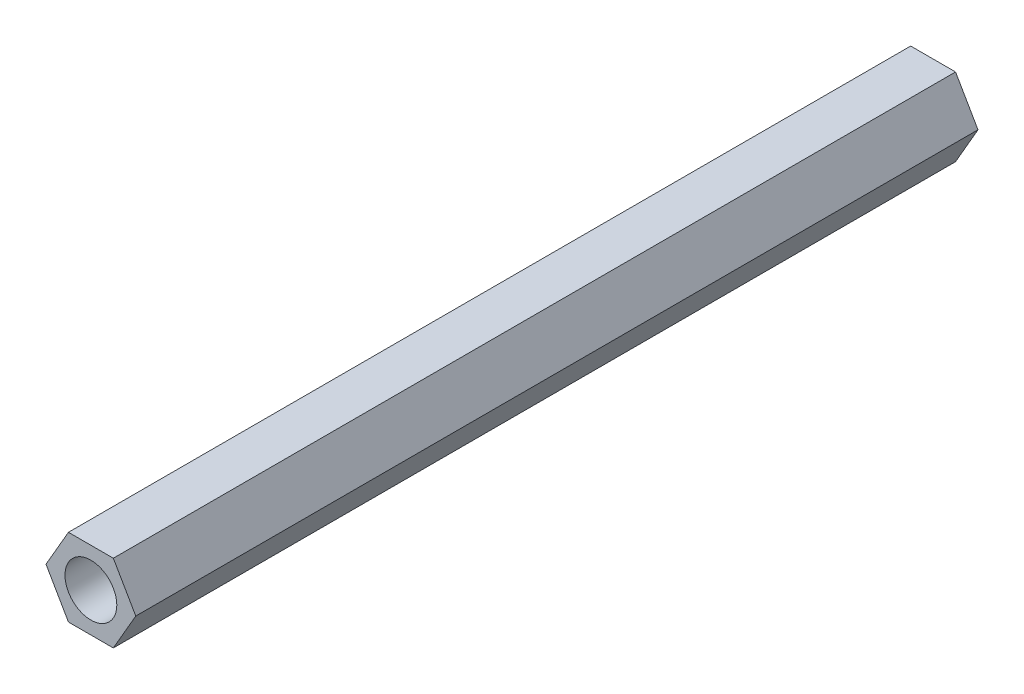
ISO-10303-21;
HEADER;
FILE_DESCRIPTION(('STEP AP214'),'2;1');
FILE_NAME('part.step','',(''),(''),'','','');
FILE_SCHEMA(('AUTOMOTIVE_DESIGN { 1 0 10303 214 1 1 1 1 }'));
ENDSEC;
DATA;
#1=APPLICATION_CONTEXT('core data for automotive mechanical design processes');
#2=APPLICATION_PROTOCOL_DEFINITION('international standard','automotive_design',2000,#1);
#3=PRODUCT_CONTEXT('',#1,'mechanical');
#4=PRODUCT('Part','Part','',(#3));
#5=PRODUCT_RELATED_PRODUCT_CATEGORY('part','',(#4));
#6=PRODUCT_DEFINITION_FORMATION('','',#4);
#7=PRODUCT_DEFINITION_CONTEXT('part definition',#1,'design');
#8=PRODUCT_DEFINITION('design','',#6,#7);
#9=PRODUCT_DEFINITION_SHAPE('','',#8);
#10=(LENGTH_UNIT() NAMED_UNIT(*) SI_UNIT(.MILLI.,.METRE.));
#11=(NAMED_UNIT(*) PLANE_ANGLE_UNIT() SI_UNIT($,.RADIAN.));
#12=(NAMED_UNIT(*) SI_UNIT($,.STERADIAN.) SOLID_ANGLE_UNIT());
#13=UNCERTAINTY_MEASURE_WITH_UNIT(LENGTH_MEASURE(1.E-05),#10,'distance_accuracy_value','');
#14=(GEOMETRIC_REPRESENTATION_CONTEXT(3) GLOBAL_UNCERTAINTY_ASSIGNED_CONTEXT((#13)) GLOBAL_UNIT_ASSIGNED_CONTEXT((#10,
#11,#12)) REPRESENTATION_CONTEXT('',''));
#15=CARTESIAN_POINT('',(0.,0.,0.));
#16=DIRECTION('',(0.,0.,1.));
#17=DIRECTION('',(1.,0.,0.));
#18=AXIS2_PLACEMENT_3D('',#15,#16,#17);
#19=CARTESIAN_POINT('',(0.,0.,65.));
#20=DIRECTION('',(0.,0.,1.));
#21=DIRECTION('',(1.,0.,0.));
#22=AXIS2_PLACEMENT_3D('',#19,#20,#21);
#23=PLANE('',#22);
#24=DIRECTION('',(-0.5,-0.866025403784439,0.));
#25=VECTOR('',#24,1.);
#26=CARTESIAN_POINT('',(-1.73205080756888,3.,65.));
#27=LINE('',#26,#25);
#28=CARTESIAN_POINT('',(-1.73205080756888,3.,65.));
#29=VERTEX_POINT('',#28);
#30=CARTESIAN_POINT('',(-3.46410161513775,0.,65.));
#31=VERTEX_POINT('',#30);
#32=EDGE_CURVE('E130',#29,#31,#27,.T.);
#33=ORIENTED_EDGE('',*,*,#32,.T.);
#34=DIRECTION('',(0.5,-0.866025403784439,0.));
#35=VECTOR('',#34,1.);
#36=CARTESIAN_POINT('',(-3.46410161513775,0.,65.));
#37=LINE('',#36,#35);
#38=CARTESIAN_POINT('',(-1.73205080756888,-3.,65.));
#39=VERTEX_POINT('',#38);
#40=EDGE_CURVE('E88',#31,#39,#37,.T.);
#41=ORIENTED_EDGE('',*,*,#40,.T.);
#42=DIRECTION('',(1.,0.,0.));
#43=VECTOR('',#42,1.);
#44=CARTESIAN_POINT('',(-1.73205080756888,-3.,65.));
#45=LINE('',#44,#43);
#46=CARTESIAN_POINT('',(1.73205080756888,-3.,65.));
#47=VERTEX_POINT('',#46);
#48=EDGE_CURVE('E101',#39,#47,#45,.T.);
#49=ORIENTED_EDGE('',*,*,#48,.T.);
#50=DIRECTION('',(0.5,0.866025403784439,0.));
#51=VECTOR('',#50,1.);
#52=CARTESIAN_POINT('',(1.73205080756888,-3.,65.));
#53=LINE('',#52,#51);
#54=CARTESIAN_POINT('',(3.46410161513775,0.,65.));
#55=VERTEX_POINT('',#54);
#56=EDGE_CURVE('E95',#47,#55,#53,.T.);
#57=ORIENTED_EDGE('',*,*,#56,.T.);
#58=DIRECTION('',(-0.5,0.866025403784439,0.));
#59=VECTOR('',#58,1.);
#60=CARTESIAN_POINT('',(3.46410161513775,0.,65.));
#61=LINE('',#60,#59);
#62=CARTESIAN_POINT('',(1.73205080756888,3.,65.));
#63=VERTEX_POINT('',#62);
#64=EDGE_CURVE('E99',#55,#63,#61,.T.);
#65=ORIENTED_EDGE('',*,*,#64,.T.);
#66=DIRECTION('',(-1.,0.,0.));
#67=VECTOR('',#66,1.);
#68=CARTESIAN_POINT('',(1.73205080756888,3.,65.));
#69=LINE('',#68,#67);
#70=EDGE_CURVE('E51',#63,#29,#69,.T.);
#71=ORIENTED_EDGE('',*,*,#70,.T.);
#72=EDGE_LOOP('',(#33,#41,#49,#57,#65,#71));
#73=FACE_BOUND('',#72,.T.);
#74=CARTESIAN_POINT('',(0.,0.,65.));
#75=DIRECTION('',(0.,0.,1.));
#76=DIRECTION('',(1.,0.,0.));
#77=AXIS2_PLACEMENT_3D('',#74,#75,#76);
#78=CIRCLE('',#77,2.);
#79=CARTESIAN_POINT('',(2.,0.,65.));
#80=VERTEX_POINT('',#79);
#81=EDGE_CURVE('E123',#80,#80,#78,.T.);
#82=ORIENTED_EDGE('',*,*,#81,.F.);
#83=EDGE_LOOP('',(#82));
#84=FACE_BOUND('',#83,.T.);
#85=ADVANCED_FACE('F34',(#73,#84),#23,.T.);
#86=CARTESIAN_POINT('',(0.,0.,0.));
#87=DIRECTION('',(0.,0.,1.));
#88=DIRECTION('',(1.,0.,0.));
#89=AXIS2_PLACEMENT_3D('',#86,#87,#88);
#90=PLANE('',#89);
#91=DIRECTION('',(-0.5,-0.866025403784439,0.));
#92=VECTOR('',#91,1.);
#93=CARTESIAN_POINT('',(-1.73205080756888,3.,0.));
#94=LINE('',#93,#92);
#95=CARTESIAN_POINT('',(-1.73205080756888,3.,0.));
#96=VERTEX_POINT('',#95);
#97=CARTESIAN_POINT('',(-3.46410161513775,0.,0.));
#98=VERTEX_POINT('',#97);
#99=EDGE_CURVE('E119',#96,#98,#94,.T.);
#100=ORIENTED_EDGE('',*,*,#99,.F.);
#101=DIRECTION('',(-1.,0.,0.));
#102=VECTOR('',#101,1.);
#103=CARTESIAN_POINT('',(1.73205080756888,3.,0.));
#104=LINE('',#103,#102);
#105=CARTESIAN_POINT('',(1.73205080756888,3.,0.));
#106=VERTEX_POINT('',#105);
#107=EDGE_CURVE('E80',#106,#96,#104,.T.);
#108=ORIENTED_EDGE('',*,*,#107,.F.);
#109=DIRECTION('',(-0.5,0.866025403784439,0.));
#110=VECTOR('',#109,1.);
#111=CARTESIAN_POINT('',(3.46410161513775,0.,0.));
#112=LINE('',#111,#110);
#113=CARTESIAN_POINT('',(3.46410161513775,0.,0.));
#114=VERTEX_POINT('',#113);
#115=EDGE_CURVE('E74',#114,#106,#112,.T.);
#116=ORIENTED_EDGE('',*,*,#115,.F.);
#117=DIRECTION('',(0.5,0.866025403784439,0.));
#118=VECTOR('',#117,1.);
#119=CARTESIAN_POINT('',(1.73205080756888,-3.,0.));
#120=LINE('',#119,#118);
#121=CARTESIAN_POINT('',(1.73205080756888,-3.,0.));
#122=VERTEX_POINT('',#121);
#123=EDGE_CURVE('E109',#122,#114,#120,.T.);
#124=ORIENTED_EDGE('',*,*,#123,.F.);
#125=DIRECTION('',(1.,0.,0.));
#126=VECTOR('',#125,1.);
#127=CARTESIAN_POINT('',(-1.73205080756888,-3.,0.));
#128=LINE('',#127,#126);
#129=CARTESIAN_POINT('',(-1.73205080756888,-3.,0.));
#130=VERTEX_POINT('',#129);
#131=EDGE_CURVE('E125',#130,#122,#128,.T.);
#132=ORIENTED_EDGE('',*,*,#131,.F.);
#133=DIRECTION('',(0.5,-0.866025403784439,0.));
#134=VECTOR('',#133,1.);
#135=CARTESIAN_POINT('',(-3.46410161513775,0.,0.));
#136=LINE('',#135,#134);
#137=EDGE_CURVE('E122',#98,#130,#136,.T.);
#138=ORIENTED_EDGE('',*,*,#137,.F.);
#139=EDGE_LOOP('',(#100,#108,#116,#124,#132,#138));
#140=FACE_BOUND('',#139,.T.);
#141=CARTESIAN_POINT('',(0.,0.,0.));
#142=DIRECTION('',(0.,0.,1.));
#143=DIRECTION('',(1.,0.,0.));
#144=AXIS2_PLACEMENT_3D('',#141,#142,#143);
#145=CIRCLE('',#144,2.);
#146=CARTESIAN_POINT('',(2.,0.,0.));
#147=VERTEX_POINT('',#146);
#148=EDGE_CURVE('E223',#147,#147,#145,.T.);
#149=ORIENTED_EDGE('',*,*,#148,.T.);
#150=EDGE_LOOP('',(#149));
#151=FACE_BOUND('',#150,.T.);
#152=ADVANCED_FACE('F139',(#140,#151),#90,.F.);
#153=CARTESIAN_POINT('',(-1.73205080756888,3.,65.));
#154=DIRECTION('',(0.866025403784439,-0.5,0.));
#155=DIRECTION('',(0.5,0.866025403784439,0.));
#156=AXIS2_PLACEMENT_3D('',#153,#154,#155);
#157=PLANE('',#156);
#158=ORIENTED_EDGE('',*,*,#99,.T.);
#159=DIRECTION('',(0.,0.,-1.));
#160=VECTOR('',#159,1.);
#161=CARTESIAN_POINT('',(-3.46410161513775,0.,65.));
#162=LINE('',#161,#160);
#163=EDGE_CURVE('E11',#31,#98,#162,.T.);
#164=ORIENTED_EDGE('',*,*,#163,.F.);
#165=ORIENTED_EDGE('',*,*,#32,.F.);
#166=DIRECTION('',(0.,0.,-1.));
#167=VECTOR('',#166,1.);
#168=CARTESIAN_POINT('',(-1.73205080756888,3.,65.));
#169=LINE('',#168,#167);
#170=EDGE_CURVE('E115',#29,#96,#169,.T.);
#171=ORIENTED_EDGE('',*,*,#170,.T.);
#172=EDGE_LOOP('',(#158,#164,#165,#171));
#173=FACE_BOUND('',#172,.T.);
#174=ADVANCED_FACE('F36',(#173),#157,.F.);
#175=CARTESIAN_POINT('',(-3.46410161513775,0.,65.));
#176=DIRECTION('',(0.866025403784439,0.5,0.));
#177=DIRECTION('',(-0.5,0.866025403784439,0.));
#178=AXIS2_PLACEMENT_3D('',#175,#176,#177);
#179=PLANE('',#178);
#180=ORIENTED_EDGE('',*,*,#137,.T.);
#181=DIRECTION('',(0.,0.,-1.));
#182=VECTOR('',#181,1.);
#183=CARTESIAN_POINT('',(-1.73205080756888,-3.,65.));
#184=LINE('',#183,#182);
#185=EDGE_CURVE('E43',#39,#130,#184,.T.);
#186=ORIENTED_EDGE('',*,*,#185,.F.);
#187=ORIENTED_EDGE('',*,*,#40,.F.);
#188=ORIENTED_EDGE('',*,*,#163,.T.);
#189=EDGE_LOOP('',(#180,#186,#187,#188));
#190=FACE_BOUND('',#189,.T.);
#191=ADVANCED_FACE('F164',(#190),#179,.F.);
#192=CARTESIAN_POINT('',(-1.73205080756888,-3.,65.));
#193=DIRECTION('',(0.,1.,0.));
#194=DIRECTION('',(0.,0.,1.));
#195=AXIS2_PLACEMENT_3D('',#192,#193,#194);
#196=PLANE('',#195);
#197=ORIENTED_EDGE('',*,*,#131,.T.);
#198=DIRECTION('',(0.,0.,-1.));
#199=VECTOR('',#198,1.);
#200=CARTESIAN_POINT('',(1.73205080756888,-3.,65.));
#201=LINE('',#200,#199);
#202=EDGE_CURVE('E110',#47,#122,#201,.T.);
#203=ORIENTED_EDGE('',*,*,#202,.F.);
#204=ORIENTED_EDGE('',*,*,#48,.F.);
#205=ORIENTED_EDGE('',*,*,#185,.T.);
#206=EDGE_LOOP('',(#197,#203,#204,#205));
#207=FACE_BOUND('',#206,.T.);
#208=ADVANCED_FACE('F136',(#207),#196,.F.);
#209=CARTESIAN_POINT('',(1.73205080756888,-3.,65.));
#210=DIRECTION('',(-0.866025403784439,0.5,0.));
#211=DIRECTION('',(-0.5,-0.866025403784439,0.));
#212=AXIS2_PLACEMENT_3D('',#209,#210,#211);
#213=PLANE('',#212);
#214=ORIENTED_EDGE('',*,*,#123,.T.);
#215=DIRECTION('',(0.,0.,-1.));
#216=VECTOR('',#215,1.);
#217=CARTESIAN_POINT('',(3.46410161513775,0.,65.));
#218=LINE('',#217,#216);
#219=EDGE_CURVE('E106',#55,#114,#218,.T.);
#220=ORIENTED_EDGE('',*,*,#219,.F.);
#221=ORIENTED_EDGE('',*,*,#56,.F.);
#222=ORIENTED_EDGE('',*,*,#202,.T.);
#223=EDGE_LOOP('',(#214,#220,#221,#222));
#224=FACE_BOUND('',#223,.T.);
#225=ADVANCED_FACE('F107',(#224),#213,.F.);
#226=CARTESIAN_POINT('',(3.46410161513775,0.,65.));
#227=DIRECTION('',(-0.866025403784439,-0.5,0.));
#228=DIRECTION('',(0.5,-0.866025403784439,0.));
#229=AXIS2_PLACEMENT_3D('',#226,#227,#228);
#230=PLANE('',#229);
#231=ORIENTED_EDGE('',*,*,#115,.T.);
#232=DIRECTION('',(0.,0.,-1.));
#233=VECTOR('',#232,1.);
#234=CARTESIAN_POINT('',(1.73205080756888,3.,65.));
#235=LINE('',#234,#233);
#236=EDGE_CURVE('E111',#63,#106,#235,.T.);
#237=ORIENTED_EDGE('',*,*,#236,.F.);
#238=ORIENTED_EDGE('',*,*,#64,.F.);
#239=ORIENTED_EDGE('',*,*,#219,.T.);
#240=EDGE_LOOP('',(#231,#237,#238,#239));
#241=FACE_BOUND('',#240,.T.);
#242=ADVANCED_FACE('F113',(#241),#230,.F.);
#243=CARTESIAN_POINT('',(1.73205080756888,3.,65.));
#244=DIRECTION('',(0.,-1.,0.));
#245=DIRECTION('',(1.,0.,0.));
#246=AXIS2_PLACEMENT_3D('',#243,#244,#245);
#247=PLANE('',#246);
#248=ORIENTED_EDGE('',*,*,#107,.T.);
#249=ORIENTED_EDGE('',*,*,#170,.F.);
#250=ORIENTED_EDGE('',*,*,#70,.F.);
#251=ORIENTED_EDGE('',*,*,#236,.T.);
#252=EDGE_LOOP('',(#248,#249,#250,#251));
#253=FACE_BOUND('',#252,.T.);
#254=ADVANCED_FACE('F144',(#253),#247,.F.);
#255=CARTESIAN_POINT('',(0.,0.,65.));
#256=DIRECTION('',(0.,0.,-1.));
#257=DIRECTION('',(-1.,0.,0.));
#258=AXIS2_PLACEMENT_3D('',#255,#256,#257);
#259=CYLINDRICAL_SURFACE('',#258,2.);
#260=ORIENTED_EDGE('',*,*,#81,.T.);
#261=EDGE_LOOP('',(#260));
#262=FACE_BOUND('',#261,.T.);
#263=ORIENTED_EDGE('',*,*,#148,.F.);
#264=EDGE_LOOP('',(#263));
#265=FACE_BOUND('',#264,.T.);
#266=ADVANCED_FACE('F146',(#262,#265),#259,.F.);
#267=CLOSED_SHELL('',(#85,#152,#174,#191,#208,#225,#242,#254,#266));
#268=MANIFOLD_SOLID_BREP('B2',#267);
#269=ADVANCED_BREP_SHAPE_REPRESENTATION('',(#18,#268),#14);
#270=SHAPE_DEFINITION_REPRESENTATION(#9,#269);
ENDSEC;
END-ISO-10303-21;
